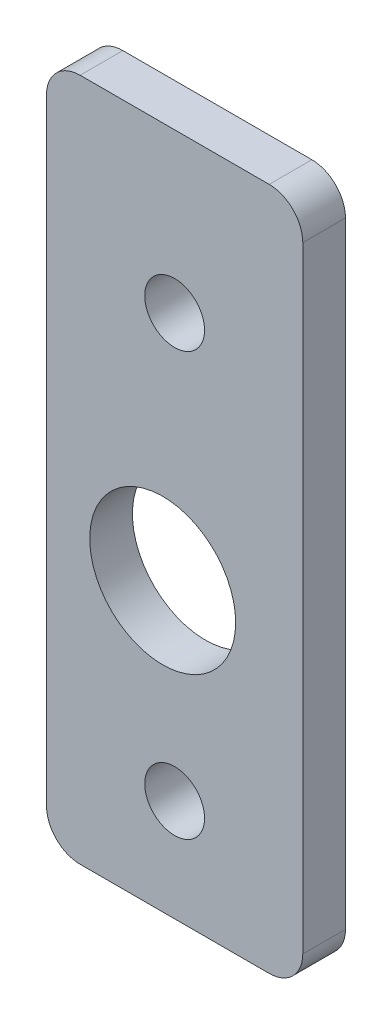
ISO-10303-21;
HEADER;
FILE_DESCRIPTION(('STEP AP214'),'2;1');
FILE_NAME('part.step','',(''),(''),'','','');
FILE_SCHEMA(('AUTOMOTIVE_DESIGN { 1 0 10303 214 1 1 1 1 }'));
ENDSEC;
DATA;
#1=APPLICATION_CONTEXT('core data for automotive mechanical design processes');
#2=APPLICATION_PROTOCOL_DEFINITION('international standard','automotive_design',2000,#1);
#3=PRODUCT_CONTEXT('',#1,'mechanical');
#4=PRODUCT('Part','Part','',(#3));
#5=PRODUCT_RELATED_PRODUCT_CATEGORY('part','',(#4));
#6=PRODUCT_DEFINITION_FORMATION('','',#4);
#7=PRODUCT_DEFINITION_CONTEXT('part definition',#1,'design');
#8=PRODUCT_DEFINITION('design','',#6,#7);
#9=PRODUCT_DEFINITION_SHAPE('','',#8);
#10=(LENGTH_UNIT() NAMED_UNIT(*) SI_UNIT(.MILLI.,.METRE.));
#11=(NAMED_UNIT(*) PLANE_ANGLE_UNIT() SI_UNIT($,.RADIAN.));
#12=(NAMED_UNIT(*) SI_UNIT($,.STERADIAN.) SOLID_ANGLE_UNIT());
#13=UNCERTAINTY_MEASURE_WITH_UNIT(LENGTH_MEASURE(1.E-05),#10,'distance_accuracy_value','');
#14=(GEOMETRIC_REPRESENTATION_CONTEXT(3) GLOBAL_UNCERTAINTY_ASSIGNED_CONTEXT((#13)) GLOBAL_UNIT_ASSIGNED_CONTEXT((#10,
#11,#12)) REPRESENTATION_CONTEXT('',''));
#15=CARTESIAN_POINT('',(0.,0.,0.));
#16=DIRECTION('',(0.,0.,1.));
#17=DIRECTION('',(1.,0.,0.));
#18=AXIS2_PLACEMENT_3D('',#15,#16,#17);
#19=CARTESIAN_POINT('',(-14.05,-172.8,6.35));
#20=DIRECTION('',(0.,0.,-1.));
#21=DIRECTION('',(-1.,0.,0.));
#22=AXIS2_PLACEMENT_3D('',#19,#20,#21);
#23=CYLINDRICAL_SURFACE('',#22,5.);
#24=DIRECTION('',(0.,0.,-1.));
#25=VECTOR('',#24,1.);
#26=CARTESIAN_POINT('',(-14.05,-177.8,6.35));
#27=LINE('',#26,#25);
#28=CARTESIAN_POINT('',(-14.05,-177.8,6.35));
#29=VERTEX_POINT('',#28);
#30=CARTESIAN_POINT('',(-14.05,-177.8,0.));
#31=VERTEX_POINT('',#30);
#32=EDGE_CURVE('E147',#29,#31,#27,.T.);
#33=ORIENTED_EDGE('',*,*,#32,.F.);
#34=CARTESIAN_POINT('',(-14.05,-172.8,6.35));
#35=DIRECTION('',(0.,0.,1.));
#36=DIRECTION('',(1.,0.,0.));
#37=AXIS2_PLACEMENT_3D('',#34,#35,#36);
#38=CIRCLE('',#37,5.);
#39=CARTESIAN_POINT('',(-19.05,-172.8,6.35));
#40=VERTEX_POINT('',#39);
#41=EDGE_CURVE('E39',#40,#29,#38,.T.);
#42=ORIENTED_EDGE('',*,*,#41,.F.);
#43=DIRECTION('',(0.,0.,-1.));
#44=VECTOR('',#43,1.);
#45=CARTESIAN_POINT('',(-19.05,-172.8,6.35));
#46=LINE('',#45,#44);
#47=CARTESIAN_POINT('',(-19.05,-172.8,0.));
#48=VERTEX_POINT('',#47);
#49=EDGE_CURVE('E150',#48,#40,#46,.F.);
#50=ORIENTED_EDGE('',*,*,#49,.F.);
#51=CARTESIAN_POINT('',(-14.05,-172.8,0.));
#52=DIRECTION('',(0.,0.,1.));
#53=DIRECTION('',(1.,0.,0.));
#54=AXIS2_PLACEMENT_3D('',#51,#52,#53);
#55=CIRCLE('',#54,5.);
#56=EDGE_CURVE('E11',#31,#48,#55,.F.);
#57=ORIENTED_EDGE('',*,*,#56,.F.);
#58=EDGE_LOOP('',(#33,#42,#50,#57));
#59=FACE_BOUND('',#58,.T.);
#60=ADVANCED_FACE('F32',(#59),#23,.T.);
#61=CARTESIAN_POINT('',(14.05,-172.8,6.35));
#62=DIRECTION('',(0.,0.,-1.));
#63=DIRECTION('',(-1.,0.,0.));
#64=AXIS2_PLACEMENT_3D('',#61,#62,#63);
#65=CYLINDRICAL_SURFACE('',#64,5.);
#66=DIRECTION('',(0.,0.,-1.));
#67=VECTOR('',#66,1.);
#68=CARTESIAN_POINT('',(19.05,-172.8,6.35));
#69=LINE('',#68,#67);
#70=CARTESIAN_POINT('',(19.05,-172.8,6.35));
#71=VERTEX_POINT('',#70);
#72=CARTESIAN_POINT('',(19.05,-172.8,0.));
#73=VERTEX_POINT('',#72);
#74=EDGE_CURVE('E136',#71,#73,#69,.T.);
#75=ORIENTED_EDGE('',*,*,#74,.F.);
#76=CARTESIAN_POINT('',(14.05,-172.8,6.35));
#77=DIRECTION('',(0.,0.,1.));
#78=DIRECTION('',(1.,0.,0.));
#79=AXIS2_PLACEMENT_3D('',#76,#77,#78);
#80=CIRCLE('',#79,5.);
#81=CARTESIAN_POINT('',(14.05,-177.8,6.35));
#82=VERTEX_POINT('',#81);
#83=EDGE_CURVE('E142',#82,#71,#80,.T.);
#84=ORIENTED_EDGE('',*,*,#83,.F.);
#85=DIRECTION('',(0.,0.,-1.));
#86=VECTOR('',#85,1.);
#87=CARTESIAN_POINT('',(14.05,-177.8,6.35));
#88=LINE('',#87,#86);
#89=CARTESIAN_POINT('',(14.05,-177.8,0.));
#90=VERTEX_POINT('',#89);
#91=EDGE_CURVE('E139',#90,#82,#88,.F.);
#92=ORIENTED_EDGE('',*,*,#91,.F.);
#93=CARTESIAN_POINT('',(14.05,-172.8,0.));
#94=DIRECTION('',(0.,0.,1.));
#95=DIRECTION('',(1.,0.,0.));
#96=AXIS2_PLACEMENT_3D('',#93,#94,#95);
#97=CIRCLE('',#96,5.);
#98=EDGE_CURVE('E144',#73,#90,#97,.F.);
#99=ORIENTED_EDGE('',*,*,#98,.F.);
#100=EDGE_LOOP('',(#75,#84,#92,#99));
#101=FACE_BOUND('',#100,.T.);
#102=ADVANCED_FACE('F180',(#101),#65,.T.);
#103=CARTESIAN_POINT('',(14.05,-81.1999999999999,6.35));
#104=DIRECTION('',(0.,0.,-1.));
#105=DIRECTION('',(-1.,0.,0.));
#106=AXIS2_PLACEMENT_3D('',#103,#104,#105);
#107=CYLINDRICAL_SURFACE('',#106,5.);
#108=DIRECTION('',(0.,0.,-1.));
#109=VECTOR('',#108,1.);
#110=CARTESIAN_POINT('',(14.05,-76.1999999999999,6.35));
#111=LINE('',#110,#109);
#112=CARTESIAN_POINT('',(14.05,-76.1999999999999,6.35));
#113=VERTEX_POINT('',#112);
#114=CARTESIAN_POINT('',(14.05,-76.1999999999999,0.));
#115=VERTEX_POINT('',#114);
#116=EDGE_CURVE('E102',#113,#115,#111,.T.);
#117=ORIENTED_EDGE('',*,*,#116,.F.);
#118=CARTESIAN_POINT('',(14.05,-81.1999999999999,6.35));
#119=DIRECTION('',(0.,0.,1.));
#120=DIRECTION('',(1.,0.,0.));
#121=AXIS2_PLACEMENT_3D('',#118,#119,#120);
#122=CIRCLE('',#121,5.);
#123=CARTESIAN_POINT('',(19.05,-81.1999999999999,6.35));
#124=VERTEX_POINT('',#123);
#125=EDGE_CURVE('E132',#124,#113,#122,.T.);
#126=ORIENTED_EDGE('',*,*,#125,.F.);
#127=DIRECTION('',(0.,0.,-1.));
#128=VECTOR('',#127,1.);
#129=CARTESIAN_POINT('',(19.05,-81.1999999999999,6.35));
#130=LINE('',#129,#128);
#131=CARTESIAN_POINT('',(19.05,-81.1999999999999,0.));
#132=VERTEX_POINT('',#131);
#133=EDGE_CURVE('E129',#132,#124,#130,.F.);
#134=ORIENTED_EDGE('',*,*,#133,.F.);
#135=CARTESIAN_POINT('',(14.05,-81.1999999999999,0.));
#136=DIRECTION('',(0.,0.,1.));
#137=DIRECTION('',(1.,0.,0.));
#138=AXIS2_PLACEMENT_3D('',#135,#136,#137);
#139=CIRCLE('',#138,5.);
#140=EDGE_CURVE('E134',#115,#132,#139,.F.);
#141=ORIENTED_EDGE('',*,*,#140,.F.);
#142=EDGE_LOOP('',(#117,#126,#134,#141));
#143=FACE_BOUND('',#142,.T.);
#144=ADVANCED_FACE('F178',(#143),#107,.T.);
#145=CARTESIAN_POINT('',(-14.05,-81.1999999999999,6.35));
#146=DIRECTION('',(0.,0.,1.));
#147=DIRECTION('',(1.,0.,0.));
#148=AXIS2_PLACEMENT_3D('',#145,#146,#147);
#149=CYLINDRICAL_SURFACE('',#148,5.);
#150=DIRECTION('',(0.,0.,1.));
#151=VECTOR('',#150,1.);
#152=CARTESIAN_POINT('',(-14.05,-76.1999999999999,6.35));
#153=LINE('',#152,#151);
#154=CARTESIAN_POINT('',(-14.05,-76.1999999999999,0.));
#155=VERTEX_POINT('',#154);
#156=CARTESIAN_POINT('',(-14.05,-76.1999999999999,6.35));
#157=VERTEX_POINT('',#156);
#158=EDGE_CURVE('E100',#155,#157,#153,.T.);
#159=ORIENTED_EDGE('',*,*,#158,.F.);
#160=CARTESIAN_POINT('',(-14.05,-81.1999999999999,0.));
#161=DIRECTION('',(0.,0.,1.));
#162=DIRECTION('',(1.,0.,0.));
#163=AXIS2_PLACEMENT_3D('',#160,#161,#162);
#164=CIRCLE('',#163,5.);
#165=CARTESIAN_POINT('',(-19.05,-81.1999999999999,0.));
#166=VERTEX_POINT('',#165);
#167=EDGE_CURVE('E107',#166,#155,#164,.F.);
#168=ORIENTED_EDGE('',*,*,#167,.F.);
#169=DIRECTION('',(0.,0.,1.));
#170=VECTOR('',#169,1.);
#171=CARTESIAN_POINT('',(-19.05,-81.1999999999999,6.35));
#172=LINE('',#171,#170);
#173=CARTESIAN_POINT('',(-19.05,-81.1999999999999,6.35));
#174=VERTEX_POINT('',#173);
#175=EDGE_CURVE('E116',#174,#166,#172,.F.);
#176=ORIENTED_EDGE('',*,*,#175,.F.);
#177=CARTESIAN_POINT('',(-14.05,-81.1999999999999,6.35));
#178=DIRECTION('',(0.,0.,1.));
#179=DIRECTION('',(1.,0.,0.));
#180=AXIS2_PLACEMENT_3D('',#177,#178,#179);
#181=CIRCLE('',#180,5.);
#182=EDGE_CURVE('E115',#157,#174,#181,.T.);
#183=ORIENTED_EDGE('',*,*,#182,.F.);
#184=EDGE_LOOP('',(#159,#168,#176,#183));
#185=FACE_BOUND('',#184,.T.);
#186=ADVANCED_FACE('F119',(#185),#149,.T.);
#187=CARTESIAN_POINT('',(0.,0.,6.35));
#188=DIRECTION('',(0.,0.,1.));
#189=DIRECTION('',(1.,0.,0.));
#190=AXIS2_PLACEMENT_3D('',#187,#188,#189);
#191=PLANE('',#190);
#192=CARTESIAN_POINT('',(0.,-162.625541615591,6.35));
#193=DIRECTION('',(0.,0.,1.));
#194=DIRECTION('',(1.,0.,0.));
#195=AXIS2_PLACEMENT_3D('',#192,#193,#194);
#196=CIRCLE('',#195,4.445);
#197=CARTESIAN_POINT('',(4.44499999999999,-162.625541615591,6.35));
#198=VERTEX_POINT('',#197);
#199=EDGE_CURVE('E222',#198,#198,#196,.T.);
#200=ORIENTED_EDGE('',*,*,#199,.F.);
#201=EDGE_LOOP('',(#200));
#202=FACE_BOUND('',#201,.T.);
#203=CARTESIAN_POINT('',(0.,-99.7883816213637,6.35));
#204=DIRECTION('',(0.,0.,1.));
#205=DIRECTION('',(1.,0.,0.));
#206=AXIS2_PLACEMENT_3D('',#203,#204,#205);
#207=CIRCLE('',#206,4.445);
#208=CARTESIAN_POINT('',(4.44499999999998,-99.7883816213637,6.35));
#209=VERTEX_POINT('',#208);
#210=EDGE_CURVE('E226',#209,#209,#207,.T.);
#211=ORIENTED_EDGE('',*,*,#210,.F.);
#212=EDGE_LOOP('',(#211));
#213=FACE_BOUND('',#212,.T.);
#214=DIRECTION('',(0.,-1.,0.));
#215=VECTOR('',#214,1.);
#216=CARTESIAN_POINT('',(-19.05,-177.8,6.35));
#217=LINE('',#216,#215);
#218=EDGE_CURVE('E104',#174,#40,#217,.T.);
#219=ORIENTED_EDGE('',*,*,#218,.T.);
#220=ORIENTED_EDGE('',*,*,#41,.T.);
#221=DIRECTION('',(1.,0.,0.));
#222=VECTOR('',#221,1.);
#223=CARTESIAN_POINT('',(19.05,-177.8,6.35));
#224=LINE('',#223,#222);
#225=EDGE_CURVE('E156',#29,#82,#224,.T.);
#226=ORIENTED_EDGE('',*,*,#225,.T.);
#227=ORIENTED_EDGE('',*,*,#83,.T.);
#228=DIRECTION('',(0.,1.,0.));
#229=VECTOR('',#228,1.);
#230=CARTESIAN_POINT('',(19.05,-177.8,6.35));
#231=LINE('',#230,#229);
#232=EDGE_CURVE('E123',#71,#124,#231,.T.);
#233=ORIENTED_EDGE('',*,*,#232,.T.);
#234=ORIENTED_EDGE('',*,*,#125,.T.);
#235=DIRECTION('',(-1.,0.,0.));
#236=VECTOR('',#235,1.);
#237=CARTESIAN_POINT('',(19.05,-76.1999999999999,6.35));
#238=LINE('',#237,#236);
#239=EDGE_CURVE('E120',#113,#157,#238,.T.);
#240=ORIENTED_EDGE('',*,*,#239,.T.);
#241=ORIENTED_EDGE('',*,*,#182,.T.);
#242=EDGE_LOOP('',(#219,#220,#226,#227,#233,#234,#240,#241));
#243=FACE_BOUND('',#242,.T.);
#244=CARTESIAN_POINT('',(-1.77800000000083,-135.128000000003,6.35));
#245=DIRECTION('',(0.,0.,1.));
#246=DIRECTION('',(1.,0.,0.));
#247=AXIS2_PLACEMENT_3D('',#244,#245,#246);
#248=CIRCLE('',#247,10.85);
#249=CARTESIAN_POINT('',(9.07199999999916,-135.128000000003,6.35));
#250=VERTEX_POINT('',#249);
#251=EDGE_CURVE('E169',#250,#250,#248,.T.);
#252=ORIENTED_EDGE('',*,*,#251,.F.);
#253=EDGE_LOOP('',(#252));
#254=FACE_BOUND('',#253,.T.);
#255=ADVANCED_FACE('F153',(#202,#213,#243,#254),#191,.T.);
#256=CARTESIAN_POINT('',(0.,0.,0.));
#257=DIRECTION('',(0.,0.,1.));
#258=DIRECTION('',(1.,0.,0.));
#259=AXIS2_PLACEMENT_3D('',#256,#257,#258);
#260=PLANE('',#259);
#261=CARTESIAN_POINT('',(0.,-162.625541615591,0.));
#262=DIRECTION('',(0.,0.,1.));
#263=DIRECTION('',(1.,0.,0.));
#264=AXIS2_PLACEMENT_3D('',#261,#262,#263);
#265=CIRCLE('',#264,4.445);
#266=CARTESIAN_POINT('',(4.44499999999999,-162.625541615591,0.));
#267=VERTEX_POINT('',#266);
#268=EDGE_CURVE('E225',#267,#267,#265,.F.);
#269=ORIENTED_EDGE('',*,*,#268,.F.);
#270=EDGE_LOOP('',(#269));
#271=FACE_BOUND('',#270,.T.);
#272=CARTESIAN_POINT('',(0.,-99.7883816213637,0.));
#273=DIRECTION('',(0.,0.,1.));
#274=DIRECTION('',(1.,0.,0.));
#275=AXIS2_PLACEMENT_3D('',#272,#273,#274);
#276=CIRCLE('',#275,4.445);
#277=CARTESIAN_POINT('',(4.44499999999998,-99.7883816213637,0.));
#278=VERTEX_POINT('',#277);
#279=EDGE_CURVE('E229',#278,#278,#276,.F.);
#280=ORIENTED_EDGE('',*,*,#279,.F.);
#281=EDGE_LOOP('',(#280));
#282=FACE_BOUND('',#281,.T.);
#283=DIRECTION('',(1.,0.,0.));
#284=VECTOR('',#283,1.);
#285=CARTESIAN_POINT('',(19.05,-177.8,0.));
#286=LINE('',#285,#284);
#287=EDGE_CURVE('E168',#31,#90,#286,.T.);
#288=ORIENTED_EDGE('',*,*,#287,.F.);
#289=ORIENTED_EDGE('',*,*,#56,.T.);
#290=DIRECTION('',(0.,-1.,0.));
#291=VECTOR('',#290,1.);
#292=CARTESIAN_POINT('',(-19.05,-177.8,0.));
#293=LINE('',#292,#291);
#294=EDGE_CURVE('E111',#166,#48,#293,.T.);
#295=ORIENTED_EDGE('',*,*,#294,.F.);
#296=ORIENTED_EDGE('',*,*,#167,.T.);
#297=DIRECTION('',(-1.,0.,0.));
#298=VECTOR('',#297,1.);
#299=CARTESIAN_POINT('',(19.05,-76.1999999999999,0.));
#300=LINE('',#299,#298);
#301=EDGE_CURVE('E95',#115,#155,#300,.T.);
#302=ORIENTED_EDGE('',*,*,#301,.F.);
#303=ORIENTED_EDGE('',*,*,#140,.T.);
#304=DIRECTION('',(0.,1.,0.));
#305=VECTOR('',#304,1.);
#306=CARTESIAN_POINT('',(19.05,-177.8,0.));
#307=LINE('',#306,#305);
#308=EDGE_CURVE('E105',#73,#132,#307,.T.);
#309=ORIENTED_EDGE('',*,*,#308,.F.);
#310=ORIENTED_EDGE('',*,*,#98,.T.);
#311=EDGE_LOOP('',(#288,#289,#295,#296,#302,#303,#309,#310));
#312=FACE_BOUND('',#311,.T.);
#313=CARTESIAN_POINT('',(-1.77800000000083,-135.128000000003,0.));
#314=DIRECTION('',(0.,0.,1.));
#315=DIRECTION('',(1.,0.,0.));
#316=AXIS2_PLACEMENT_3D('',#313,#314,#315);
#317=CIRCLE('',#316,10.85);
#318=CARTESIAN_POINT('',(9.07199999999916,-135.128000000003,0.));
#319=VERTEX_POINT('',#318);
#320=EDGE_CURVE('E235',#319,#319,#317,.T.);
#321=ORIENTED_EDGE('',*,*,#320,.T.);
#322=EDGE_LOOP('',(#321));
#323=FACE_BOUND('',#322,.T.);
#324=ADVANCED_FACE('F108',(#271,#282,#312,#323),#260,.F.);
#325=CARTESIAN_POINT('',(-19.05,-177.8,6.35));
#326=DIRECTION('',(1.,0.,0.));
#327=DIRECTION('',(0.,1.,0.));
#328=AXIS2_PLACEMENT_3D('',#325,#326,#327);
#329=PLANE('',#328);
#330=ORIENTED_EDGE('',*,*,#294,.T.);
#331=ORIENTED_EDGE('',*,*,#49,.T.);
#332=ORIENTED_EDGE('',*,*,#218,.F.);
#333=ORIENTED_EDGE('',*,*,#175,.T.);
#334=EDGE_LOOP('',(#330,#331,#332,#333));
#335=FACE_BOUND('',#334,.T.);
#336=ADVANCED_FACE('F190',(#335),#329,.F.);
#337=CARTESIAN_POINT('',(19.05,-177.8,6.35));
#338=DIRECTION('',(0.,1.,0.));
#339=DIRECTION('',(0.,0.,1.));
#340=AXIS2_PLACEMENT_3D('',#337,#338,#339);
#341=PLANE('',#340);
#342=ORIENTED_EDGE('',*,*,#225,.F.);
#343=ORIENTED_EDGE('',*,*,#32,.T.);
#344=ORIENTED_EDGE('',*,*,#287,.T.);
#345=ORIENTED_EDGE('',*,*,#91,.T.);
#346=EDGE_LOOP('',(#342,#343,#344,#345));
#347=FACE_BOUND('',#346,.T.);
#348=ADVANCED_FACE('F160',(#347),#341,.F.);
#349=CARTESIAN_POINT('',(19.05,-177.8,6.35));
#350=DIRECTION('',(-1.,0.,0.));
#351=DIRECTION('',(0.,-1.,0.));
#352=AXIS2_PLACEMENT_3D('',#349,#350,#351);
#353=PLANE('',#352);
#354=ORIENTED_EDGE('',*,*,#232,.F.);
#355=ORIENTED_EDGE('',*,*,#74,.T.);
#356=ORIENTED_EDGE('',*,*,#308,.T.);
#357=ORIENTED_EDGE('',*,*,#133,.T.);
#358=EDGE_LOOP('',(#354,#355,#356,#357));
#359=FACE_BOUND('',#358,.T.);
#360=ADVANCED_FACE('F173',(#359),#353,.F.);
#361=CARTESIAN_POINT('',(19.05,-76.1999999999999,6.35));
#362=DIRECTION('',(0.,-1.,0.));
#363=DIRECTION('',(0.,0.,-1.));
#364=AXIS2_PLACEMENT_3D('',#361,#362,#363);
#365=PLANE('',#364);
#366=ORIENTED_EDGE('',*,*,#239,.F.);
#367=ORIENTED_EDGE('',*,*,#116,.T.);
#368=ORIENTED_EDGE('',*,*,#301,.T.);
#369=ORIENTED_EDGE('',*,*,#158,.T.);
#370=EDGE_LOOP('',(#366,#367,#368,#369));
#371=FACE_BOUND('',#370,.T.);
#372=ADVANCED_FACE('F98',(#371),#365,.F.);
#373=CARTESIAN_POINT('',(-1.77800000000083,-135.128000000003,6.35));
#374=DIRECTION('',(0.,0.,-1.));
#375=DIRECTION('',(-1.,0.,0.));
#376=AXIS2_PLACEMENT_3D('',#373,#374,#375);
#377=CYLINDRICAL_SURFACE('',#376,10.85);
#378=ORIENTED_EDGE('',*,*,#251,.T.);
#379=EDGE_LOOP('',(#378));
#380=FACE_BOUND('',#379,.T.);
#381=ORIENTED_EDGE('',*,*,#320,.F.);
#382=EDGE_LOOP('',(#381));
#383=FACE_BOUND('',#382,.T.);
#384=ADVANCED_FACE('F200',(#380,#383),#377,.F.);
#385=CARTESIAN_POINT('',(0.,-99.7883816213637,-0.00100000000000013));
#386=DIRECTION('',(0.,0.,1.));
#387=DIRECTION('',(1.,0.,0.));
#388=AXIS2_PLACEMENT_3D('',#385,#386,#387);
#389=CYLINDRICAL_SURFACE('',#388,4.445);
#390=ORIENTED_EDGE('',*,*,#210,.T.);
#391=EDGE_LOOP('',(#390));
#392=FACE_BOUND('',#391,.T.);
#393=ORIENTED_EDGE('',*,*,#279,.T.);
#394=EDGE_LOOP('',(#393));
#395=FACE_BOUND('',#394,.T.);
#396=ADVANCED_FACE('F209',(#392,#395),#389,.F.);
#397=CARTESIAN_POINT('',(0.,-162.625541615591,-0.00100000000000013));
#398=DIRECTION('',(0.,0.,1.));
#399=DIRECTION('',(1.,0.,0.));
#400=AXIS2_PLACEMENT_3D('',#397,#398,#399);
#401=CYLINDRICAL_SURFACE('',#400,4.445);
#402=ORIENTED_EDGE('',*,*,#199,.T.);
#403=EDGE_LOOP('',(#402));
#404=FACE_BOUND('',#403,.T.);
#405=ORIENTED_EDGE('',*,*,#268,.T.);
#406=EDGE_LOOP('',(#405));
#407=FACE_BOUND('',#406,.T.);
#408=ADVANCED_FACE('F213',(#404,#407),#401,.F.);
#409=CLOSED_SHELL('',(#60,#102,#144,#186,#255,#324,#336,#348,#360,#372,#384,#396,#408));
#410=MANIFOLD_SOLID_BREP('B2',#409);
#411=ADVANCED_BREP_SHAPE_REPRESENTATION('',(#18,#410),#14);
#412=SHAPE_DEFINITION_REPRESENTATION(#9,#411);
ENDSEC;
END-ISO-10303-21;
